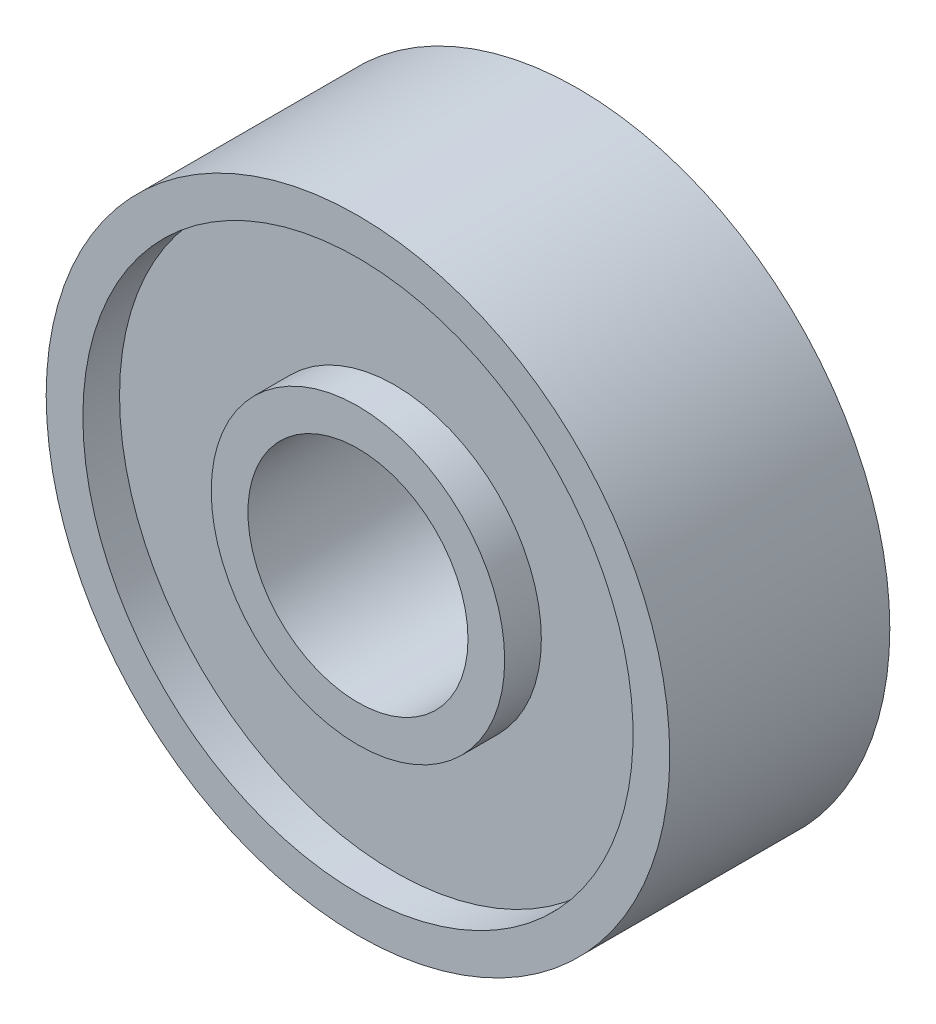
ISO-10303-21;
HEADER;
FILE_DESCRIPTION(('STEP AP214'),'2;1');
FILE_NAME('part.step','',(''),(''),'','','');
FILE_SCHEMA(('AUTOMOTIVE_DESIGN { 1 0 10303 214 1 1 1 1 }'));
ENDSEC;
DATA;
#1=APPLICATION_CONTEXT('core data for automotive mechanical design processes');
#2=APPLICATION_PROTOCOL_DEFINITION('international standard','automotive_design',2000,#1);
#3=PRODUCT_CONTEXT('',#1,'mechanical');
#4=PRODUCT('Part','Part','',(#3));
#5=PRODUCT_RELATED_PRODUCT_CATEGORY('part','',(#4));
#6=PRODUCT_DEFINITION_FORMATION('','',#4);
#7=PRODUCT_DEFINITION_CONTEXT('part definition',#1,'design');
#8=PRODUCT_DEFINITION('design','',#6,#7);
#9=PRODUCT_DEFINITION_SHAPE('','',#8);
#10=(LENGTH_UNIT() NAMED_UNIT(*) SI_UNIT(.MILLI.,.METRE.));
#11=(NAMED_UNIT(*) PLANE_ANGLE_UNIT() SI_UNIT($,.RADIAN.));
#12=(NAMED_UNIT(*) SI_UNIT($,.STERADIAN.) SOLID_ANGLE_UNIT());
#13=UNCERTAINTY_MEASURE_WITH_UNIT(LENGTH_MEASURE(1.E-05),#10,'distance_accuracy_value','');
#14=(GEOMETRIC_REPRESENTATION_CONTEXT(3) GLOBAL_UNCERTAINTY_ASSIGNED_CONTEXT((#13)) GLOBAL_UNIT_ASSIGNED_CONTEXT((#10,
#11,#12)) REPRESENTATION_CONTEXT('',''));
#15=CARTESIAN_POINT('',(0.,0.,0.));
#16=DIRECTION('',(0.,0.,1.));
#17=DIRECTION('',(1.,0.,0.));
#18=AXIS2_PLACEMENT_3D('',#15,#16,#17);
#19=CARTESIAN_POINT('',(0.,0.,6.));
#20=DIRECTION('',(0.,0.,1.));
#21=DIRECTION('',(1.,0.,0.));
#22=AXIS2_PLACEMENT_3D('',#19,#20,#21);
#23=PLANE('',#22);
#24=CARTESIAN_POINT('',(0.,0.,6.));
#25=DIRECTION('',(0.,0.,-1.));
#26=DIRECTION('',(-1.,0.,0.));
#27=AXIS2_PLACEMENT_3D('',#24,#25,#26);
#28=CIRCLE('',#27,4.);
#29=CARTESIAN_POINT('',(-4.,0.,6.));
#30=VERTEX_POINT('',#29);
#31=EDGE_CURVE('E87',#30,#30,#28,.T.);
#32=ORIENTED_EDGE('',*,*,#31,.F.);
#33=EDGE_LOOP('',(#32));
#34=FACE_BOUND('',#33,.T.);
#35=CARTESIAN_POINT('',(0.,0.,6.));
#36=DIRECTION('',(0.,0.,1.));
#37=DIRECTION('',(1.,0.,0.));
#38=AXIS2_PLACEMENT_3D('',#35,#36,#37);
#39=CIRCLE('',#38,3.);
#40=CARTESIAN_POINT('',(3.,0.,6.));
#41=VERTEX_POINT('',#40);
#42=EDGE_CURVE('E50',#41,#41,#39,.T.);
#43=ORIENTED_EDGE('',*,*,#42,.F.);
#44=EDGE_LOOP('',(#43));
#45=FACE_BOUND('',#44,.T.);
#46=ADVANCED_FACE('F37',(#34,#45),#23,.T.);
#47=CARTESIAN_POINT('',(0.,0.,0.));
#48=DIRECTION('',(0.,0.,1.));
#49=DIRECTION('',(1.,0.,0.));
#50=AXIS2_PLACEMENT_3D('',#47,#48,#49);
#51=PLANE('',#50);
#52=CARTESIAN_POINT('',(0.,0.,0.));
#53=DIRECTION('',(0.,0.,-1.));
#54=DIRECTION('',(-1.,0.,0.));
#55=AXIS2_PLACEMENT_3D('',#52,#53,#54);
#56=CIRCLE('',#55,4.);
#57=CARTESIAN_POINT('',(-4.,0.,0.));
#58=VERTEX_POINT('',#57);
#59=EDGE_CURVE('E71',#58,#58,#56,.T.);
#60=ORIENTED_EDGE('',*,*,#59,.T.);
#61=EDGE_LOOP('',(#60));
#62=FACE_BOUND('',#61,.T.);
#63=CARTESIAN_POINT('',(0.,0.,0.));
#64=DIRECTION('',(0.,0.,1.));
#65=DIRECTION('',(1.,0.,0.));
#66=AXIS2_PLACEMENT_3D('',#63,#64,#65);
#67=CIRCLE('',#66,3.);
#68=CARTESIAN_POINT('',(3.,0.,0.));
#69=VERTEX_POINT('',#68);
#70=EDGE_CURVE('E52',#69,#69,#67,.T.);
#71=ORIENTED_EDGE('',*,*,#70,.T.);
#72=EDGE_LOOP('',(#71));
#73=FACE_BOUND('',#72,.T.);
#74=ADVANCED_FACE('F97',(#62,#73),#51,.F.);
#75=CARTESIAN_POINT('',(0.,0.,6.));
#76=DIRECTION('',(0.,0.,-1.));
#77=DIRECTION('',(-1.,0.,0.));
#78=AXIS2_PLACEMENT_3D('',#75,#76,#77);
#79=CIRCLE('',#78,7.5);
#80=CARTESIAN_POINT('',(-7.5,0.,6.));
#81=VERTEX_POINT('',#80);
#82=EDGE_CURVE('E83',#81,#81,#79,.T.);
#83=ORIENTED_EDGE('',*,*,#82,.T.);
#84=EDGE_LOOP('',(#83));
#85=FACE_BOUND('',#84,.T.);
#86=CARTESIAN_POINT('',(0.,0.,6.));
#87=DIRECTION('',(0.,0.,1.));
#88=DIRECTION('',(1.,0.,0.));
#89=AXIS2_PLACEMENT_3D('',#86,#87,#88);
#90=CIRCLE('',#89,8.5);
#91=CARTESIAN_POINT('',(8.5,0.,6.));
#92=VERTEX_POINT('',#91);
#93=EDGE_CURVE('E10',#92,#92,#90,.T.);
#94=ORIENTED_EDGE('',*,*,#93,.T.);
#95=EDGE_LOOP('',(#94));
#96=FACE_BOUND('',#95,.T.);
#97=ADVANCED_FACE('F99',(#85,#96),#23,.T.);
#98=CARTESIAN_POINT('',(0.,0.,0.));
#99=DIRECTION('',(0.,0.,-1.));
#100=DIRECTION('',(-1.,0.,0.));
#101=AXIS2_PLACEMENT_3D('',#98,#99,#100);
#102=CIRCLE('',#101,7.5);
#103=CARTESIAN_POINT('',(-7.5,0.,0.));
#104=VERTEX_POINT('',#103);
#105=EDGE_CURVE('E67',#104,#104,#102,.T.);
#106=ORIENTED_EDGE('',*,*,#105,.F.);
#107=EDGE_LOOP('',(#106));
#108=FACE_BOUND('',#107,.T.);
#109=CARTESIAN_POINT('',(0.,0.,0.));
#110=DIRECTION('',(0.,0.,1.));
#111=DIRECTION('',(1.,0.,0.));
#112=AXIS2_PLACEMENT_3D('',#109,#110,#111);
#113=CIRCLE('',#112,8.5);
#114=CARTESIAN_POINT('',(8.5,0.,0.));
#115=VERTEX_POINT('',#114);
#116=EDGE_CURVE('E41',#115,#115,#113,.T.);
#117=ORIENTED_EDGE('',*,*,#116,.F.);
#118=EDGE_LOOP('',(#117));
#119=FACE_BOUND('',#118,.T.);
#120=ADVANCED_FACE('F111',(#108,#119),#51,.F.);
#121=CARTESIAN_POINT('',(0.,0.,6.));
#122=DIRECTION('',(0.,0.,-1.));
#123=DIRECTION('',(-1.,0.,0.));
#124=AXIS2_PLACEMENT_3D('',#121,#122,#123);
#125=CYLINDRICAL_SURFACE('',#124,8.5);
#126=ORIENTED_EDGE('',*,*,#93,.F.);
#127=EDGE_LOOP('',(#126));
#128=FACE_BOUND('',#127,.T.);
#129=ORIENTED_EDGE('',*,*,#116,.T.);
#130=EDGE_LOOP('',(#129));
#131=FACE_BOUND('',#130,.T.);
#132=ADVANCED_FACE('F39',(#128,#131),#125,.T.);
#133=CARTESIAN_POINT('',(0.,0.,6.));
#134=DIRECTION('',(0.,0.,-1.));
#135=DIRECTION('',(-1.,0.,0.));
#136=AXIS2_PLACEMENT_3D('',#133,#134,#135);
#137=CYLINDRICAL_SURFACE('',#136,3.);
#138=ORIENTED_EDGE('',*,*,#42,.T.);
#139=EDGE_LOOP('',(#138));
#140=FACE_BOUND('',#139,.T.);
#141=ORIENTED_EDGE('',*,*,#70,.F.);
#142=EDGE_LOOP('',(#141));
#143=FACE_BOUND('',#142,.T.);
#144=ADVANCED_FACE('F102',(#140,#143),#137,.F.);
#145=CARTESIAN_POINT('',(0.,0.,0.));
#146=DIRECTION('',(0.,0.,-1.));
#147=DIRECTION('',(-1.,0.,0.));
#148=AXIS2_PLACEMENT_3D('',#145,#146,#147);
#149=CYLINDRICAL_SURFACE('',#148,4.);
#150=CARTESIAN_POINT('',(0.,0.,1.));
#151=DIRECTION('',(0.,0.,-1.));
#152=DIRECTION('',(-1.,0.,0.));
#153=AXIS2_PLACEMENT_3D('',#150,#151,#152);
#154=CIRCLE('',#153,4.);
#155=CARTESIAN_POINT('',(-4.,0.,1.));
#156=VERTEX_POINT('',#155);
#157=EDGE_CURVE('E56',#156,#156,#154,.T.);
#158=ORIENTED_EDGE('',*,*,#157,.T.);
#159=EDGE_LOOP('',(#158));
#160=FACE_BOUND('',#159,.T.);
#161=ORIENTED_EDGE('',*,*,#59,.F.);
#162=EDGE_LOOP('',(#161));
#163=FACE_BOUND('',#162,.T.);
#164=ADVANCED_FACE('F105',(#160,#163),#149,.T.);
#165=CARTESIAN_POINT('',(4.,0.,1.));
#166=DIRECTION('',(0.,0.,-1.));
#167=DIRECTION('',(-1.,0.,0.));
#168=AXIS2_PLACEMENT_3D('',#165,#166,#167);
#169=PLANE('',#168);
#170=CARTESIAN_POINT('',(0.,0.,1.));
#171=DIRECTION('',(0.,0.,-1.));
#172=DIRECTION('',(-1.,0.,0.));
#173=AXIS2_PLACEMENT_3D('',#170,#171,#172);
#174=CIRCLE('',#173,7.5);
#175=CARTESIAN_POINT('',(-7.5,0.,1.));
#176=VERTEX_POINT('',#175);
#177=EDGE_CURVE('E63',#176,#176,#174,.T.);
#178=ORIENTED_EDGE('',*,*,#177,.T.);
#179=EDGE_LOOP('',(#178));
#180=FACE_BOUND('',#179,.T.);
#181=ORIENTED_EDGE('',*,*,#157,.F.);
#182=EDGE_LOOP('',(#181));
#183=FACE_BOUND('',#182,.T.);
#184=ADVANCED_FACE('F130',(#180,#183),#169,.T.);
#185=CARTESIAN_POINT('',(0.,0.,0.));
#186=DIRECTION('',(0.,0.,-1.));
#187=DIRECTION('',(-1.,0.,0.));
#188=AXIS2_PLACEMENT_3D('',#185,#186,#187);
#189=CYLINDRICAL_SURFACE('',#188,7.5);
#190=ORIENTED_EDGE('',*,*,#105,.T.);
#191=EDGE_LOOP('',(#190));
#192=FACE_BOUND('',#191,.T.);
#193=ORIENTED_EDGE('',*,*,#177,.F.);
#194=EDGE_LOOP('',(#193));
#195=FACE_BOUND('',#194,.T.);
#196=ADVANCED_FACE('F127',(#192,#195),#189,.F.);
#197=CARTESIAN_POINT('',(0.,0.,0.));
#198=DIRECTION('',(0.,0.,-1.));
#199=DIRECTION('',(-1.,0.,0.));
#200=AXIS2_PLACEMENT_3D('',#197,#198,#199);
#201=CYLINDRICAL_SURFACE('',#200,4.);
#202=ORIENTED_EDGE('',*,*,#31,.T.);
#203=EDGE_LOOP('',(#202));
#204=FACE_BOUND('',#203,.T.);
#205=CARTESIAN_POINT('',(0.,0.,5.));
#206=DIRECTION('',(0.,0.,-1.));
#207=DIRECTION('',(-1.,0.,0.));
#208=AXIS2_PLACEMENT_3D('',#205,#206,#207);
#209=CIRCLE('',#208,4.);
#210=CARTESIAN_POINT('',(-4.,0.,5.));
#211=VERTEX_POINT('',#210);
#212=EDGE_CURVE('E75',#211,#211,#209,.T.);
#213=ORIENTED_EDGE('',*,*,#212,.F.);
#214=EDGE_LOOP('',(#213));
#215=FACE_BOUND('',#214,.T.);
#216=ADVANCED_FACE('F92',(#204,#215),#201,.T.);
#217=CARTESIAN_POINT('',(4.,0.,5.));
#218=DIRECTION('',(0.,0.,1.));
#219=DIRECTION('',(1.,0.,0.));
#220=AXIS2_PLACEMENT_3D('',#217,#218,#219);
#221=PLANE('',#220);
#222=ORIENTED_EDGE('',*,*,#212,.T.);
#223=EDGE_LOOP('',(#222));
#224=FACE_BOUND('',#223,.T.);
#225=CARTESIAN_POINT('',(0.,0.,5.));
#226=DIRECTION('',(0.,0.,-1.));
#227=DIRECTION('',(-1.,0.,0.));
#228=AXIS2_PLACEMENT_3D('',#225,#226,#227);
#229=CIRCLE('',#228,7.5);
#230=CARTESIAN_POINT('',(-7.5,0.,5.));
#231=VERTEX_POINT('',#230);
#232=EDGE_CURVE('E79',#231,#231,#229,.T.);
#233=ORIENTED_EDGE('',*,*,#232,.F.);
#234=EDGE_LOOP('',(#233));
#235=FACE_BOUND('',#234,.T.);
#236=ADVANCED_FACE('F148',(#224,#235),#221,.T.);
#237=CARTESIAN_POINT('',(0.,0.,0.));
#238=DIRECTION('',(0.,0.,-1.));
#239=DIRECTION('',(-1.,0.,0.));
#240=AXIS2_PLACEMENT_3D('',#237,#238,#239);
#241=CYLINDRICAL_SURFACE('',#240,7.5);
#242=ORIENTED_EDGE('',*,*,#232,.T.);
#243=EDGE_LOOP('',(#242));
#244=FACE_BOUND('',#243,.T.);
#245=ORIENTED_EDGE('',*,*,#82,.F.);
#246=EDGE_LOOP('',(#245));
#247=FACE_BOUND('',#246,.T.);
#248=ADVANCED_FACE('F151',(#244,#247),#241,.F.);
#249=CLOSED_SHELL('',(#46,#74,#97,#120,#132,#144,#164,#184,#196,#216,#236,#248));
#250=MANIFOLD_SOLID_BREP('B2',#249);
#251=ADVANCED_BREP_SHAPE_REPRESENTATION('',(#18,#250),#14);
#252=SHAPE_DEFINITION_REPRESENTATION(#9,#251);
ENDSEC;
END-ISO-10303-21;
